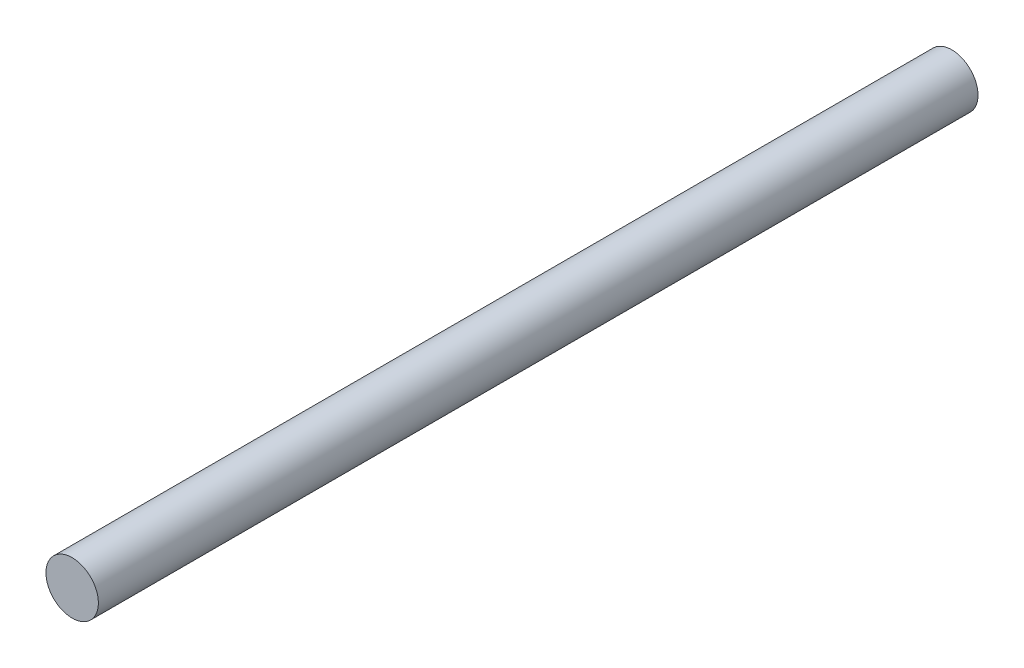
ISO-10303-21;
HEADER;
FILE_DESCRIPTION(('STEP AP214'),'2;1');
FILE_NAME('part.step','',(''),(''),'','','');
FILE_SCHEMA(('AUTOMOTIVE_DESIGN { 1 0 10303 214 1 1 1 1 }'));
ENDSEC;
DATA;
#1=APPLICATION_CONTEXT('core data for automotive mechanical design processes');
#2=APPLICATION_PROTOCOL_DEFINITION('international standard','automotive_design',2000,#1);
#3=PRODUCT_CONTEXT('',#1,'mechanical');
#4=PRODUCT('Part','Part','',(#3));
#5=PRODUCT_RELATED_PRODUCT_CATEGORY('part','',(#4));
#6=PRODUCT_DEFINITION_FORMATION('','',#4);
#7=PRODUCT_DEFINITION_CONTEXT('part definition',#1,'design');
#8=PRODUCT_DEFINITION('design','',#6,#7);
#9=PRODUCT_DEFINITION_SHAPE('','',#8);
#10=(LENGTH_UNIT() NAMED_UNIT(*) SI_UNIT(.MILLI.,.METRE.));
#11=(NAMED_UNIT(*) PLANE_ANGLE_UNIT() SI_UNIT($,.RADIAN.));
#12=(NAMED_UNIT(*) SI_UNIT($,.STERADIAN.) SOLID_ANGLE_UNIT());
#13=UNCERTAINTY_MEASURE_WITH_UNIT(LENGTH_MEASURE(1.E-05),#10,'distance_accuracy_value','');
#14=(GEOMETRIC_REPRESENTATION_CONTEXT(3) GLOBAL_UNCERTAINTY_ASSIGNED_CONTEXT((#13)) GLOBAL_UNIT_ASSIGNED_CONTEXT((#10,
#11,#12)) REPRESENTATION_CONTEXT('',''));
#15=CARTESIAN_POINT('',(0.,0.,0.));
#16=DIRECTION('',(0.,0.,1.));
#17=DIRECTION('',(1.,0.,0.));
#18=AXIS2_PLACEMENT_3D('',#15,#16,#17);
#19=CARTESIAN_POINT('',(0.,0.,33.55));
#20=DIRECTION('',(0.,0.,-1.));
#21=DIRECTION('',(-1.,0.,0.));
#22=AXIS2_PLACEMENT_3D('',#19,#20,#21);
#23=CYLINDRICAL_SURFACE('',#22,2.);
#24=CARTESIAN_POINT('',(0.,0.,33.55));
#25=DIRECTION('',(0.,0.,1.));
#26=DIRECTION('',(1.,0.,0.));
#27=AXIS2_PLACEMENT_3D('',#24,#25,#26);
#28=CIRCLE('',#27,2.);
#29=CARTESIAN_POINT('',(2.,0.,33.55));
#30=VERTEX_POINT('',#29);
#31=EDGE_CURVE('E10',#30,#30,#28,.T.);
#32=ORIENTED_EDGE('',*,*,#31,.F.);
#33=EDGE_LOOP('',(#32));
#34=FACE_BOUND('',#33,.T.);
#35=CARTESIAN_POINT('',(0.,0.,-33.55));
#36=DIRECTION('',(0.,0.,1.));
#37=DIRECTION('',(1.,0.,0.));
#38=AXIS2_PLACEMENT_3D('',#35,#36,#37);
#39=CIRCLE('',#38,2.);
#40=CARTESIAN_POINT('',(2.,0.,-33.55));
#41=VERTEX_POINT('',#40);
#42=EDGE_CURVE('E46',#41,#41,#39,.T.);
#43=ORIENTED_EDGE('',*,*,#42,.T.);
#44=EDGE_LOOP('',(#43));
#45=FACE_BOUND('',#44,.T.);
#46=ADVANCED_FACE('F43',(#34,#45),#23,.T.);
#47=CARTESIAN_POINT('',(0.,0.,33.55));
#48=DIRECTION('',(0.,0.,1.));
#49=DIRECTION('',(1.,0.,0.));
#50=AXIS2_PLACEMENT_3D('',#47,#48,#49);
#51=PLANE('',#50);
#52=ORIENTED_EDGE('',*,*,#31,.T.);
#53=EDGE_LOOP('',(#52));
#54=FACE_BOUND('',#53,.T.);
#55=ADVANCED_FACE('F60',(#54),#51,.T.);
#56=CARTESIAN_POINT('',(0.,0.,-33.55));
#57=DIRECTION('',(0.,0.,1.));
#58=DIRECTION('',(1.,0.,0.));
#59=AXIS2_PLACEMENT_3D('',#56,#57,#58);
#60=PLANE('',#59);
#61=ORIENTED_EDGE('',*,*,#42,.F.);
#62=EDGE_LOOP('',(#61));
#63=FACE_BOUND('',#62,.T.);
#64=ADVANCED_FACE('F58',(#63),#60,.F.);
#65=CLOSED_SHELL('',(#46,#55,#64));
#66=MANIFOLD_SOLID_BREP('B2',#65);
#67=ADVANCED_BREP_SHAPE_REPRESENTATION('',(#18,#66),#14);
#68=SHAPE_DEFINITION_REPRESENTATION(#9,#67);
ENDSEC;
END-ISO-10303-21;
